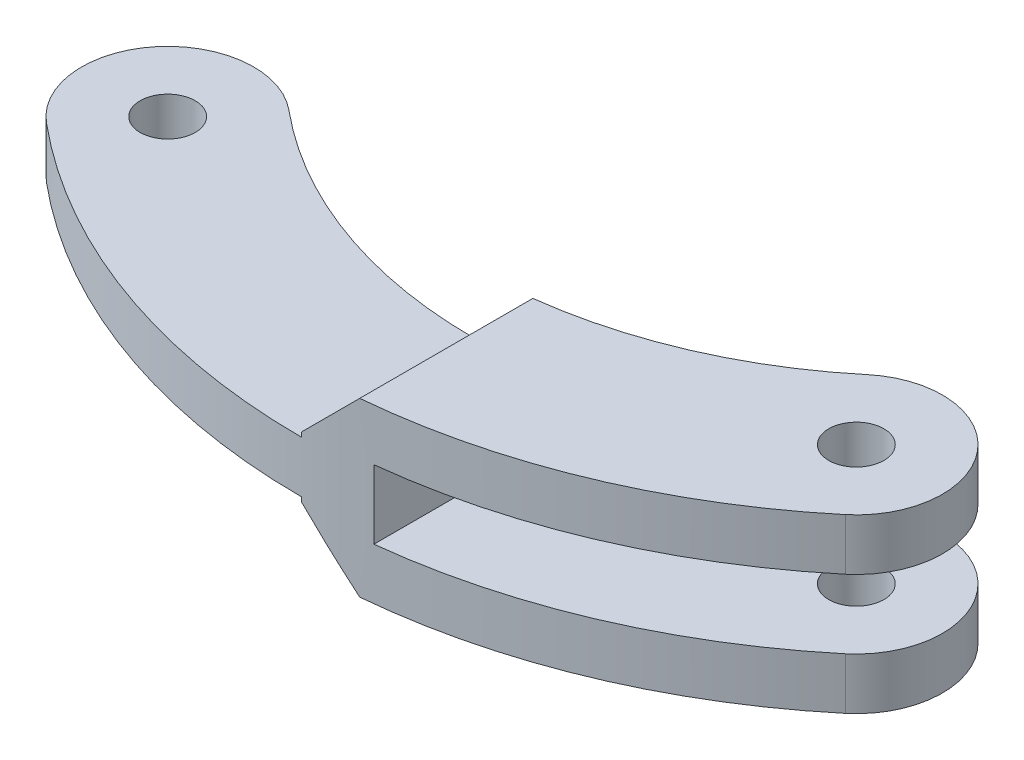
ISO-10303-21;
HEADER;
FILE_DESCRIPTION(('STEP AP214'),'2;1');
FILE_NAME('part.step','',(''),(''),'','','');
FILE_SCHEMA(('AUTOMOTIVE_DESIGN { 1 0 10303 214 1 1 1 1 }'));
ENDSEC;
DATA;
#1=APPLICATION_CONTEXT('core data for automotive mechanical design processes');
#2=APPLICATION_PROTOCOL_DEFINITION('international standard','automotive_design',2000,#1);
#3=PRODUCT_CONTEXT('',#1,'mechanical');
#4=PRODUCT('Part','Part','',(#3));
#5=PRODUCT_RELATED_PRODUCT_CATEGORY('part','',(#4));
#6=PRODUCT_DEFINITION_FORMATION('','',#4);
#7=PRODUCT_DEFINITION_CONTEXT('part definition',#1,'design');
#8=PRODUCT_DEFINITION('design','',#6,#7);
#9=PRODUCT_DEFINITION_SHAPE('','',#8);
#10=(LENGTH_UNIT() NAMED_UNIT(*) SI_UNIT(.MILLI.,.METRE.));
#11=(NAMED_UNIT(*) PLANE_ANGLE_UNIT() SI_UNIT($,.RADIAN.));
#12=(NAMED_UNIT(*) SI_UNIT($,.STERADIAN.) SOLID_ANGLE_UNIT());
#13=UNCERTAINTY_MEASURE_WITH_UNIT(LENGTH_MEASURE(1.E-05),#10,'distance_accuracy_value','');
#14=(GEOMETRIC_REPRESENTATION_CONTEXT(3) GLOBAL_UNCERTAINTY_ASSIGNED_CONTEXT((#13)) GLOBAL_UNIT_ASSIGNED_CONTEXT((#10,
#11,#12)) REPRESENTATION_CONTEXT('',''));
#15=CARTESIAN_POINT('',(0.,0.,0.));
#16=DIRECTION('',(0.,0.,1.));
#17=DIRECTION('',(1.,0.,0.));
#18=AXIS2_PLACEMENT_3D('',#15,#16,#17);
#19=CARTESIAN_POINT('',(20.,0.75,0.));
#20=DIRECTION('',(0.,-1.,0.));
#21=DIRECTION('',(0.,0.,-1.));
#22=AXIS2_PLACEMENT_3D('',#19,#20,#21);
#23=CYLINDRICAL_SURFACE('',#22,2.5);
#24=CARTESIAN_POINT('',(20.,1.,0.));
#25=DIRECTION('',(0.,1.,0.));
#26=DIRECTION('',(0.,0.,1.));
#27=AXIS2_PLACEMENT_3D('',#24,#25,#26);
#28=CIRCLE('',#27,2.5);
#29=CARTESIAN_POINT('',(21.6004609991612,1.,1.92055319899344));
#30=VERTEX_POINT('',#29);
#31=CARTESIAN_POINT('',(18.3995390008388,1.,-1.92055319899344));
#32=VERTEX_POINT('',#31);
#33=EDGE_CURVE('E167',#30,#32,#28,.T.);
#34=ORIENTED_EDGE('',*,*,#33,.T.);
#35=DIRECTION('',(0.,-1.,0.));
#36=VECTOR('',#35,1.);
#37=CARTESIAN_POINT('',(18.3995390008388,0.75,-1.92055319899344));
#38=LINE('',#37,#36);
#39=CARTESIAN_POINT('',(18.3995390008388,2.5,-1.92055319899344));
#40=VERTEX_POINT('',#39);
#41=EDGE_CURVE('E228',#40,#32,#38,.T.);
#42=ORIENTED_EDGE('',*,*,#41,.F.);
#43=CARTESIAN_POINT('',(20.,2.5,0.));
#44=DIRECTION('',(0.,1.,0.));
#45=DIRECTION('',(0.,0.,-1.));
#46=AXIS2_PLACEMENT_3D('',#43,#44,#45);
#47=CIRCLE('',#46,2.5);
#48=CARTESIAN_POINT('',(21.6004609991612,2.5,1.92055319899344));
#49=VERTEX_POINT('',#48);
#50=EDGE_CURVE('E182',#49,#40,#47,.T.);
#51=ORIENTED_EDGE('',*,*,#50,.F.);
#52=DIRECTION('',(0.,-1.,0.));
#53=VECTOR('',#52,1.);
#54=CARTESIAN_POINT('',(21.6004609991612,0.75,1.92055319899344));
#55=LINE('',#54,#53);
#56=EDGE_CURVE('E231',#49,#30,#55,.T.);
#57=ORIENTED_EDGE('',*,*,#56,.T.);
#58=EDGE_LOOP('',(#34,#42,#51,#57));
#59=FACE_BOUND('',#58,.T.);
#60=ADVANCED_FACE('F34',(#59),#23,.T.);
#61=CARTESIAN_POINT('',(20.,0.75,0.));
#62=DIRECTION('',(0.,-1.,0.));
#63=DIRECTION('',(0.,0.,-1.));
#64=AXIS2_PLACEMENT_3D('',#61,#62,#63);
#65=CYLINDRICAL_SURFACE('',#64,0.799999999999999);
#66=CARTESIAN_POINT('',(20.,1.,0.));
#67=DIRECTION('',(0.,1.,0.));
#68=DIRECTION('',(0.,0.,1.));
#69=AXIS2_PLACEMENT_3D('',#66,#67,#68);
#70=CIRCLE('',#69,0.799999999999999);
#71=CARTESIAN_POINT('',(20.,1.,0.799999999999999));
#72=VERTEX_POINT('',#71);
#73=EDGE_CURVE('E158',#72,#72,#70,.T.);
#74=ORIENTED_EDGE('',*,*,#73,.F.);
#75=EDGE_LOOP('',(#74));
#76=FACE_BOUND('',#75,.T.);
#77=CARTESIAN_POINT('',(20.,2.5,0.));
#78=DIRECTION('',(0.,1.,0.));
#79=DIRECTION('',(0.,0.,1.));
#80=AXIS2_PLACEMENT_3D('',#77,#78,#79);
#81=CIRCLE('',#80,0.800000000000006);
#82=CARTESIAN_POINT('',(20.,2.5,0.800000000000006));
#83=VERTEX_POINT('',#82);
#84=EDGE_CURVE('E170',#83,#83,#81,.T.);
#85=ORIENTED_EDGE('',*,*,#84,.T.);
#86=EDGE_LOOP('',(#85));
#87=FACE_BOUND('',#86,.T.);
#88=ADVANCED_FACE('F309',(#76,#87),#65,.F.);
#89=CARTESIAN_POINT('',(15.,0.75,-6.));
#90=DIRECTION('',(0.,1.,0.));
#91=DIRECTION('',(0.,0.,1.));
#92=AXIS2_PLACEMENT_3D('',#89,#90,#91);
#93=PLANE('',#92);
#94=CARTESIAN_POINT('',(0.,0.75,0.));
#95=DIRECTION('',(0.,1.,0.));
#96=DIRECTION('',(0.,0.,1.));
#97=AXIS2_PLACEMENT_3D('',#94,#95,#96);
#98=CIRCLE('',#97,0.8);
#99=CARTESIAN_POINT('',(0.,0.75,0.8));
#100=VERTEX_POINT('',#99);
#101=EDGE_CURVE('E202',#100,#100,#98,.T.);
#102=ORIENTED_EDGE('',*,*,#101,.F.);
#103=EDGE_LOOP('',(#102));
#104=FACE_BOUND('',#103,.T.);
#105=CARTESIAN_POINT('',(10.,0.75,-12.));
#106=DIRECTION('',(0.,1.,0.));
#107=DIRECTION('',(0.,0.,1.));
#108=AXIS2_PLACEMENT_3D('',#105,#106,#107);
#109=CIRCLE('',#108,18.1204993518133);
#110=CARTESIAN_POINT('',(-1.6004609991612,0.75,1.92055319899344));
#111=VERTEX_POINT('',#110);
#112=CARTESIAN_POINT('',(10.,0.75,6.12049935181331));
#113=VERTEX_POINT('',#112);
#114=EDGE_CURVE('E208',#111,#113,#109,.T.);
#115=ORIENTED_EDGE('',*,*,#114,.T.);
#116=DIRECTION('',(0.,0.,-1.));
#117=VECTOR('',#116,1.);
#118=CARTESIAN_POINT('',(10.,0.75,-6.));
#119=LINE('',#118,#117);
#120=CARTESIAN_POINT('',(10.,0.75,1.12049935181331));
#121=VERTEX_POINT('',#120);
#122=EDGE_CURVE('E198',#113,#121,#119,.T.);
#123=ORIENTED_EDGE('',*,*,#122,.T.);
#124=CARTESIAN_POINT('',(10.,0.75,-12.));
#125=DIRECTION('',(0.,-1.,0.));
#126=DIRECTION('',(0.,0.,-1.));
#127=AXIS2_PLACEMENT_3D('',#124,#125,#126);
#128=CIRCLE('',#127,13.1204993518133);
#129=CARTESIAN_POINT('',(1.6004609991612,0.75,-1.92055319899344));
#130=VERTEX_POINT('',#129);
#131=EDGE_CURVE('E211',#121,#130,#128,.T.);
#132=ORIENTED_EDGE('',*,*,#131,.T.);
#133=CARTESIAN_POINT('',(0.,0.75,0.));
#134=DIRECTION('',(0.,1.,0.));
#135=DIRECTION('',(0.,0.,1.));
#136=AXIS2_PLACEMENT_3D('',#133,#134,#135);
#137=CIRCLE('',#136,2.5);
#138=EDGE_CURVE('E214',#130,#111,#137,.T.);
#139=ORIENTED_EDGE('',*,*,#138,.T.);
#140=EDGE_LOOP('',(#115,#123,#132,#139));
#141=FACE_BOUND('',#140,.T.);
#142=ADVANCED_FACE('F281',(#104,#141),#93,.T.);
#143=CARTESIAN_POINT('',(15.,-0.75,-6.));
#144=DIRECTION('',(0.,1.,0.));
#145=DIRECTION('',(0.,0.,1.));
#146=AXIS2_PLACEMENT_3D('',#143,#144,#145);
#147=PLANE('',#146);
#148=CARTESIAN_POINT('',(0.,-0.75,0.));
#149=DIRECTION('',(0.,1.,0.));
#150=DIRECTION('',(0.,0.,1.));
#151=AXIS2_PLACEMENT_3D('',#148,#149,#150);
#152=CIRCLE('',#151,0.8);
#153=CARTESIAN_POINT('',(0.,-0.75,0.8));
#154=VERTEX_POINT('',#153);
#155=EDGE_CURVE('E201',#154,#154,#152,.T.);
#156=ORIENTED_EDGE('',*,*,#155,.T.);
#157=EDGE_LOOP('',(#156));
#158=FACE_BOUND('',#157,.T.);
#159=DIRECTION('',(0.,0.,-1.));
#160=VECTOR('',#159,1.);
#161=CARTESIAN_POINT('',(10.,-0.75,-6.));
#162=LINE('',#161,#160);
#163=CARTESIAN_POINT('',(10.,-0.75,6.12049935181331));
#164=VERTEX_POINT('',#163);
#165=CARTESIAN_POINT('',(10.,-0.75,1.12049935181331));
#166=VERTEX_POINT('',#165);
#167=EDGE_CURVE('E196',#164,#166,#162,.T.);
#168=ORIENTED_EDGE('',*,*,#167,.F.);
#169=CARTESIAN_POINT('',(10.,-0.75,-12.));
#170=DIRECTION('',(0.,1.,0.));
#171=DIRECTION('',(0.,0.,1.));
#172=AXIS2_PLACEMENT_3D('',#169,#170,#171);
#173=CIRCLE('',#172,18.1204993518133);
#174=CARTESIAN_POINT('',(-1.6004609991612,-0.75,1.92055319899344));
#175=VERTEX_POINT('',#174);
#176=EDGE_CURVE('E205',#175,#164,#173,.T.);
#177=ORIENTED_EDGE('',*,*,#176,.F.);
#178=CARTESIAN_POINT('',(0.,-0.75,0.));
#179=DIRECTION('',(0.,1.,0.));
#180=DIRECTION('',(0.,0.,1.));
#181=AXIS2_PLACEMENT_3D('',#178,#179,#180);
#182=CIRCLE('',#181,2.5);
#183=CARTESIAN_POINT('',(1.6004609991612,-0.75,-1.92055319899344));
#184=VERTEX_POINT('',#183);
#185=EDGE_CURVE('E212',#184,#175,#182,.T.);
#186=ORIENTED_EDGE('',*,*,#185,.F.);
#187=CARTESIAN_POINT('',(10.,-0.75,-12.));
#188=DIRECTION('',(0.,-1.,0.));
#189=DIRECTION('',(0.,0.,-1.));
#190=AXIS2_PLACEMENT_3D('',#187,#188,#189);
#191=CIRCLE('',#190,13.1204993518133);
#192=EDGE_CURVE('E219',#166,#184,#191,.T.);
#193=ORIENTED_EDGE('',*,*,#192,.F.);
#194=EDGE_LOOP('',(#168,#177,#186,#193));
#195=FACE_BOUND('',#194,.T.);
#196=ADVANCED_FACE('F290',(#158,#195),#147,.F.);
#197=CARTESIAN_POINT('',(10.,0.75,-12.));
#198=DIRECTION('',(0.,-1.,0.));
#199=DIRECTION('',(0.,0.,-1.));
#200=AXIS2_PLACEMENT_3D('',#197,#198,#199);
#201=CYLINDRICAL_SURFACE('',#200,18.1204993518133);
#202=DIRECTION('',(0.,-1.,0.));
#203=VECTOR('',#202,1.);
#204=CARTESIAN_POINT('',(12.,0.75,6.00978891489477));
#205=LINE('',#204,#203);
#206=CARTESIAN_POINT('',(12.,-1.,6.00978891489477));
#207=VERTEX_POINT('',#206);
#208=CARTESIAN_POINT('',(12.,1.,6.00978891489477));
#209=VERTEX_POINT('',#208);
#210=EDGE_CURVE('E138',#207,#209,#205,.F.);
#211=ORIENTED_EDGE('',*,*,#210,.T.);
#212=CARTESIAN_POINT('',(10.,1.,-12.));
#213=DIRECTION('',(0.,1.,0.));
#214=DIRECTION('',(0.,0.,1.));
#215=AXIS2_PLACEMENT_3D('',#212,#213,#214);
#216=CIRCLE('',#215,18.1204993518133);
#217=EDGE_CURVE('E148',#209,#30,#216,.T.);
#218=ORIENTED_EDGE('',*,*,#217,.T.);
#219=ORIENTED_EDGE('',*,*,#56,.F.);
#220=CARTESIAN_POINT('',(10.,2.5,-12.));
#221=DIRECTION('',(0.,1.,0.));
#222=DIRECTION('',(0.,0.,1.));
#223=AXIS2_PLACEMENT_3D('',#220,#221,#222);
#224=CIRCLE('',#223,18.1204993518133);
#225=CARTESIAN_POINT('',(11.625,2.5,6.04748934780311));
#226=VERTEX_POINT('',#225);
#227=EDGE_CURVE('E179',#226,#49,#224,.T.);
#228=ORIENTED_EDGE('',*,*,#227,.F.);
#229=CARTESIAN_POINT('',(10.,0.874999999999996,-12.));
#230=DIRECTION('',(-0.707106781186549,0.707106781186546,0.));
#231=DIRECTION('',(-0.707106781186546,-0.707106781186549,0.));
#232=AXIS2_PLACEMENT_3D('',#229,#230,#231);
#233=ELLIPSE('',#232,25.6262559403073,18.1204993518133);
#234=CARTESIAN_POINT('',(10.,0.874999999999999,6.12049935181331));
#235=VERTEX_POINT('',#234);
#236=EDGE_CURVE('E239',#226,#235,#233,.F.);
#237=ORIENTED_EDGE('',*,*,#236,.T.);
#238=DIRECTION('',(0.,-1.,0.));
#239=VECTOR('',#238,1.);
#240=CARTESIAN_POINT('',(10.,2.5,6.12049935181331));
#241=LINE('',#240,#239);
#242=EDGE_CURVE('E191',#235,#113,#241,.T.);
#243=ORIENTED_EDGE('',*,*,#242,.T.);
#244=ORIENTED_EDGE('',*,*,#114,.F.);
#245=DIRECTION('',(0.,-1.,0.));
#246=VECTOR('',#245,1.);
#247=CARTESIAN_POINT('',(-1.6004609991612,0.75,1.92055319899344));
#248=LINE('',#247,#246);
#249=EDGE_CURVE('E216',#111,#175,#248,.T.);
#250=ORIENTED_EDGE('',*,*,#249,.T.);
#251=ORIENTED_EDGE('',*,*,#176,.T.);
#252=CARTESIAN_POINT('',(10.,-0.875000000000009,6.12049935181331));
#253=VERTEX_POINT('',#252);
#254=EDGE_CURVE('E185',#164,#253,#241,.T.);
#255=ORIENTED_EDGE('',*,*,#254,.T.);
#256=CARTESIAN_POINT('',(10.,-0.875000000000006,-12.));
#257=DIRECTION('',(0.707106781186546,0.707106781186549,0.));
#258=DIRECTION('',(0.707106781186549,-0.707106781186546,0.));
#259=AXIS2_PLACEMENT_3D('',#256,#257,#258);
#260=ELLIPSE('',#259,25.6262559403072,18.1204993518133);
#261=CARTESIAN_POINT('',(11.625,-2.5,6.04748934780311));
#262=VERTEX_POINT('',#261);
#263=EDGE_CURVE('E237',#253,#262,#260,.T.);
#264=ORIENTED_EDGE('',*,*,#263,.T.);
#265=CARTESIAN_POINT('',(10.,-2.5,-12.));
#266=DIRECTION('',(0.,1.,0.));
#267=DIRECTION('',(0.,0.,1.));
#268=AXIS2_PLACEMENT_3D('',#265,#266,#267);
#269=CIRCLE('',#268,18.1204993518133);
#270=CARTESIAN_POINT('',(21.6004609991612,-2.5,1.92055319899344));
#271=VERTEX_POINT('',#270);
#272=EDGE_CURVE('E187',#262,#271,#269,.T.);
#273=ORIENTED_EDGE('',*,*,#272,.T.);
#274=CARTESIAN_POINT('',(21.6004609991612,-1.,1.92055319899344));
#275=VERTEX_POINT('',#274);
#276=EDGE_CURVE('E157',#275,#271,#55,.T.);
#277=ORIENTED_EDGE('',*,*,#276,.F.);
#278=CARTESIAN_POINT('',(10.,-1.,-12.));
#279=DIRECTION('',(0.,-1.,0.));
#280=DIRECTION('',(0.,0.,-1.));
#281=AXIS2_PLACEMENT_3D('',#278,#279,#280);
#282=CIRCLE('',#281,18.1204993518133);
#283=EDGE_CURVE('E151',#275,#207,#282,.T.);
#284=ORIENTED_EDGE('',*,*,#283,.T.);
#285=EDGE_LOOP('',(#211,#218,#219,#228,#237,#243,#244,#250,#251,#255,#264,#273,#277,#284));
#286=FACE_BOUND('',#285,.T.);
#287=ADVANCED_FACE('F155',(#286),#201,.T.);
#288=CARTESIAN_POINT('',(18.3995390008388,-1.,-1.92055319899344));
#289=VERTEX_POINT('',#288);
#290=CARTESIAN_POINT('',(18.3995390008388,-2.5,-1.92055319899344));
#291=VERTEX_POINT('',#290);
#292=EDGE_CURVE('E227',#289,#291,#38,.T.);
#293=ORIENTED_EDGE('',*,*,#292,.F.);
#294=CARTESIAN_POINT('',(20.,-1.,0.));
#295=DIRECTION('',(0.,-1.,0.));
#296=DIRECTION('',(0.,0.,-1.));
#297=AXIS2_PLACEMENT_3D('',#294,#295,#296);
#298=CIRCLE('',#297,2.5);
#299=EDGE_CURVE('E49',#289,#275,#298,.T.);
#300=ORIENTED_EDGE('',*,*,#299,.T.);
#301=ORIENTED_EDGE('',*,*,#276,.T.);
#302=CARTESIAN_POINT('',(20.,-2.5,0.));
#303=DIRECTION('',(0.,1.,0.));
#304=DIRECTION('',(0.,0.,-1.));
#305=AXIS2_PLACEMENT_3D('',#302,#303,#304);
#306=CIRCLE('',#305,2.5);
#307=EDGE_CURVE('E180',#271,#291,#306,.T.);
#308=ORIENTED_EDGE('',*,*,#307,.T.);
#309=EDGE_LOOP('',(#293,#300,#301,#308));
#310=FACE_BOUND('',#309,.T.);
#311=ADVANCED_FACE('F305',(#310),#23,.T.);
#312=CARTESIAN_POINT('',(10.,0.75,-12.));
#313=DIRECTION('',(0.,-1.,0.));
#314=DIRECTION('',(0.,0.,-1.));
#315=AXIS2_PLACEMENT_3D('',#312,#313,#314);
#316=CYLINDRICAL_SURFACE('',#315,13.1204993518133);
#317=ORIENTED_EDGE('',*,*,#41,.T.);
#318=CARTESIAN_POINT('',(10.,1.,-12.));
#319=DIRECTION('',(0.,1.,0.));
#320=DIRECTION('',(0.,0.,1.));
#321=AXIS2_PLACEMENT_3D('',#318,#319,#320);
#322=CIRCLE('',#321,13.1204993518133);
#323=CARTESIAN_POINT('',(12.,1.,0.967170209453312));
#324=VERTEX_POINT('',#323);
#325=EDGE_CURVE('E161',#32,#324,#322,.F.);
#326=ORIENTED_EDGE('',*,*,#325,.T.);
#327=DIRECTION('',(0.,-1.,0.));
#328=VECTOR('',#327,1.);
#329=CARTESIAN_POINT('',(12.,0.75,0.967170209453312));
#330=LINE('',#329,#328);
#331=CARTESIAN_POINT('',(12.,-1.,0.967170209453312));
#332=VERTEX_POINT('',#331);
#333=EDGE_CURVE('E11',#324,#332,#330,.T.);
#334=ORIENTED_EDGE('',*,*,#333,.T.);
#335=CARTESIAN_POINT('',(10.,-1.,-12.));
#336=DIRECTION('',(0.,-1.,0.));
#337=DIRECTION('',(0.,0.,-1.));
#338=AXIS2_PLACEMENT_3D('',#335,#336,#337);
#339=CIRCLE('',#338,13.1204993518133);
#340=EDGE_CURVE('E152',#332,#289,#339,.F.);
#341=ORIENTED_EDGE('',*,*,#340,.T.);
#342=ORIENTED_EDGE('',*,*,#292,.T.);
#343=CARTESIAN_POINT('',(10.,-2.5,-12.));
#344=DIRECTION('',(0.,-1.,0.));
#345=DIRECTION('',(0.,0.,1.));
#346=AXIS2_PLACEMENT_3D('',#343,#344,#345);
#347=CIRCLE('',#346,13.1204993518133);
#348=CARTESIAN_POINT('',(11.625,-2.5,1.01948072086339));
#349=VERTEX_POINT('',#348);
#350=EDGE_CURVE('E173',#291,#349,#347,.T.);
#351=ORIENTED_EDGE('',*,*,#350,.T.);
#352=CARTESIAN_POINT('',(10.,-0.875000000000006,-12.));
#353=DIRECTION('',(0.707106781186546,0.707106781186549,0.));
#354=DIRECTION('',(0.707106781186549,-0.707106781186546,0.));
#355=AXIS2_PLACEMENT_3D('',#352,#353,#354);
#356=ELLIPSE('',#355,18.5551881284417,13.1204993518133);
#357=CARTESIAN_POINT('',(10.,-0.875000000000009,1.12049935181331));
#358=VERTEX_POINT('',#357);
#359=EDGE_CURVE('E57',#349,#358,#356,.F.);
#360=ORIENTED_EDGE('',*,*,#359,.T.);
#361=DIRECTION('',(0.,-1.,0.));
#362=VECTOR('',#361,1.);
#363=CARTESIAN_POINT('',(10.,2.5,1.12049935181331));
#364=LINE('',#363,#362);
#365=EDGE_CURVE('E193',#166,#358,#364,.T.);
#366=ORIENTED_EDGE('',*,*,#365,.F.);
#367=ORIENTED_EDGE('',*,*,#192,.T.);
#368=DIRECTION('',(0.,-1.,0.));
#369=VECTOR('',#368,1.);
#370=CARTESIAN_POINT('',(1.6004609991612,0.75,-1.92055319899344));
#371=LINE('',#370,#369);
#372=EDGE_CURVE('E224',#130,#184,#371,.T.);
#373=ORIENTED_EDGE('',*,*,#372,.F.);
#374=ORIENTED_EDGE('',*,*,#131,.F.);
#375=CARTESIAN_POINT('',(10.,0.874999999999999,1.12049935181331));
#376=VERTEX_POINT('',#375);
#377=EDGE_CURVE('E194',#376,#121,#364,.T.);
#378=ORIENTED_EDGE('',*,*,#377,.F.);
#379=CARTESIAN_POINT('',(10.,0.874999999999996,-12.));
#380=DIRECTION('',(-0.707106781186549,0.707106781186546,0.));
#381=DIRECTION('',(-0.707106781186546,-0.707106781186549,0.));
#382=AXIS2_PLACEMENT_3D('',#379,#380,#381);
#383=ELLIPSE('',#382,18.5551881284418,13.1204993518133);
#384=CARTESIAN_POINT('',(11.625,2.5,1.01948072086339));
#385=VERTEX_POINT('',#384);
#386=EDGE_CURVE('E244',#376,#385,#383,.T.);
#387=ORIENTED_EDGE('',*,*,#386,.T.);
#388=CARTESIAN_POINT('',(10.,2.5,-12.));
#389=DIRECTION('',(0.,-1.,0.));
#390=DIRECTION('',(0.,0.,1.));
#391=AXIS2_PLACEMENT_3D('',#388,#389,#390);
#392=CIRCLE('',#391,13.1204993518133);
#393=EDGE_CURVE('E176',#40,#385,#392,.T.);
#394=ORIENTED_EDGE('',*,*,#393,.F.);
#395=EDGE_LOOP('',(#317,#326,#334,#341,#342,#351,#360,#366,#367,#373,#374,#378,#387,#394));
#396=FACE_BOUND('',#395,.T.);
#397=ADVANCED_FACE('F258',(#396),#316,.F.);
#398=CARTESIAN_POINT('',(0.,0.75,0.));
#399=DIRECTION('',(0.,-1.,0.));
#400=DIRECTION('',(0.,0.,-1.));
#401=AXIS2_PLACEMENT_3D('',#398,#399,#400);
#402=CYLINDRICAL_SURFACE('',#401,2.5);
#403=ORIENTED_EDGE('',*,*,#185,.T.);
#404=ORIENTED_EDGE('',*,*,#249,.F.);
#405=ORIENTED_EDGE('',*,*,#138,.F.);
#406=ORIENTED_EDGE('',*,*,#372,.T.);
#407=EDGE_LOOP('',(#403,#404,#405,#406));
#408=FACE_BOUND('',#407,.T.);
#409=ADVANCED_FACE('F295',(#408),#402,.T.);
#410=CARTESIAN_POINT('',(0.,0.75,0.));
#411=DIRECTION('',(0.,-1.,0.));
#412=DIRECTION('',(0.,0.,-1.));
#413=AXIS2_PLACEMENT_3D('',#410,#411,#412);
#414=CYLINDRICAL_SURFACE('',#413,0.8);
#415=ORIENTED_EDGE('',*,*,#101,.T.);
#416=EDGE_LOOP('',(#415));
#417=FACE_BOUND('',#416,.T.);
#418=ORIENTED_EDGE('',*,*,#155,.F.);
#419=EDGE_LOOP('',(#418));
#420=FACE_BOUND('',#419,.T.);
#421=ADVANCED_FACE('F297',(#417,#420),#414,.F.);
#422=CARTESIAN_POINT('',(10.,2.5,1.12049935181331));
#423=DIRECTION('',(1.,0.,0.));
#424=DIRECTION('',(0.,0.,-1.));
#425=AXIS2_PLACEMENT_3D('',#422,#423,#424);
#426=PLANE('',#425);
#427=ORIENTED_EDGE('',*,*,#365,.T.);
#428=DIRECTION('',(0.,0.,1.));
#429=VECTOR('',#428,1.);
#430=CARTESIAN_POINT('',(10.,-0.875000000000009,1.12049935181331));
#431=LINE('',#430,#429);
#432=EDGE_CURVE('E246',#358,#253,#431,.T.);
#433=ORIENTED_EDGE('',*,*,#432,.T.);
#434=ORIENTED_EDGE('',*,*,#254,.F.);
#435=ORIENTED_EDGE('',*,*,#167,.T.);
#436=EDGE_LOOP('',(#427,#433,#434,#435));
#437=FACE_BOUND('',#436,.T.);
#438=ADVANCED_FACE('F293',(#437),#426,.F.);
#439=CARTESIAN_POINT('',(10.,-2.5,-12.));
#440=DIRECTION('',(0.,1.,0.));
#441=DIRECTION('',(0.,0.,1.));
#442=AXIS2_PLACEMENT_3D('',#439,#440,#441);
#443=PLANE('',#442);
#444=ORIENTED_EDGE('',*,*,#272,.F.);
#445=DIRECTION('',(0.,0.,-1.));
#446=VECTOR('',#445,1.);
#447=CARTESIAN_POINT('',(11.625,-2.5,-12.));
#448=LINE('',#447,#446);
#449=EDGE_CURVE('E42',#262,#349,#448,.T.);
#450=ORIENTED_EDGE('',*,*,#449,.T.);
#451=ORIENTED_EDGE('',*,*,#350,.F.);
#452=ORIENTED_EDGE('',*,*,#307,.F.);
#453=EDGE_LOOP('',(#444,#450,#451,#452));
#454=FACE_BOUND('',#453,.T.);
#455=CARTESIAN_POINT('',(20.,-2.5,0.));
#456=DIRECTION('',(0.,1.,0.));
#457=DIRECTION('',(0.,0.,1.));
#458=AXIS2_PLACEMENT_3D('',#455,#456,#457);
#459=CIRCLE('',#458,0.800000000000006);
#460=CARTESIAN_POINT('',(20.,-2.5,0.800000000000006));
#461=VERTEX_POINT('',#460);
#462=EDGE_CURVE('E147',#461,#461,#459,.T.);
#463=ORIENTED_EDGE('',*,*,#462,.T.);
#464=EDGE_LOOP('',(#463));
#465=FACE_BOUND('',#464,.T.);
#466=ADVANCED_FACE('F330',(#454,#465),#443,.F.);
#467=CARTESIAN_POINT('',(20.,-1.,0.));
#468=DIRECTION('',(0.,-1.,0.));
#469=DIRECTION('',(0.,0.,-1.));
#470=AXIS2_PLACEMENT_3D('',#467,#468,#469);
#471=CIRCLE('',#470,0.799999999999999);
#472=CARTESIAN_POINT('',(20.,-1.,-0.799999999999999));
#473=VERTEX_POINT('',#472);
#474=EDGE_CURVE('E250',#473,#473,#471,.T.);
#475=ORIENTED_EDGE('',*,*,#474,.F.);
#476=EDGE_LOOP('',(#475));
#477=FACE_BOUND('',#476,.T.);
#478=ORIENTED_EDGE('',*,*,#462,.F.);
#479=EDGE_LOOP('',(#478));
#480=FACE_BOUND('',#479,.T.);
#481=ADVANCED_FACE('F316',(#477,#480),#65,.F.);
#482=CARTESIAN_POINT('',(10.,2.5,-12.));
#483=DIRECTION('',(0.,1.,0.));
#484=DIRECTION('',(0.,0.,1.));
#485=AXIS2_PLACEMENT_3D('',#482,#483,#484);
#486=PLANE('',#485);
#487=ORIENTED_EDGE('',*,*,#393,.T.);
#488=DIRECTION('',(0.,0.,1.));
#489=VECTOR('',#488,1.);
#490=CARTESIAN_POINT('',(11.625,2.5,6.12049935181331));
#491=LINE('',#490,#489);
#492=EDGE_CURVE('E234',#385,#226,#491,.T.);
#493=ORIENTED_EDGE('',*,*,#492,.T.);
#494=ORIENTED_EDGE('',*,*,#227,.T.);
#495=ORIENTED_EDGE('',*,*,#50,.T.);
#496=EDGE_LOOP('',(#487,#493,#494,#495));
#497=FACE_BOUND('',#496,.T.);
#498=ORIENTED_EDGE('',*,*,#84,.F.);
#499=EDGE_LOOP('',(#498));
#500=FACE_BOUND('',#499,.T.);
#501=ADVANCED_FACE('F263',(#497,#500),#486,.T.);
#502=ORIENTED_EDGE('',*,*,#242,.F.);
#503=DIRECTION('',(0.,0.,-1.));
#504=VECTOR('',#503,1.);
#505=CARTESIAN_POINT('',(10.,0.874999999999999,1.12049935181331));
#506=LINE('',#505,#504);
#507=EDGE_CURVE('E241',#235,#376,#506,.T.);
#508=ORIENTED_EDGE('',*,*,#507,.T.);
#509=ORIENTED_EDGE('',*,*,#377,.T.);
#510=ORIENTED_EDGE('',*,*,#122,.F.);
#511=EDGE_LOOP('',(#502,#508,#509,#510));
#512=FACE_BOUND('',#511,.T.);
#513=ADVANCED_FACE('F274',(#512),#426,.F.);
#514=CARTESIAN_POINT('',(11.625,2.5,-12.));
#515=DIRECTION('',(-0.707106781186549,0.707106781186546,0.));
#516=DIRECTION('',(0.,0.,-1.));
#517=AXIS2_PLACEMENT_3D('',#514,#515,#516);
#518=PLANE('',#517);
#519=ORIENTED_EDGE('',*,*,#386,.F.);
#520=ORIENTED_EDGE('',*,*,#507,.F.);
#521=ORIENTED_EDGE('',*,*,#236,.F.);
#522=ORIENTED_EDGE('',*,*,#492,.F.);
#523=EDGE_LOOP('',(#519,#520,#521,#522));
#524=FACE_BOUND('',#523,.T.);
#525=ADVANCED_FACE('F277',(#524),#518,.T.);
#526=CARTESIAN_POINT('',(10.,-0.875000000000009,1.12049935181331));
#527=DIRECTION('',(0.707106781186546,0.707106781186549,0.));
#528=DIRECTION('',(0.,0.,1.));
#529=AXIS2_PLACEMENT_3D('',#526,#527,#528);
#530=PLANE('',#529);
#531=ORIENTED_EDGE('',*,*,#359,.F.);
#532=ORIENTED_EDGE('',*,*,#449,.F.);
#533=ORIENTED_EDGE('',*,*,#263,.F.);
#534=ORIENTED_EDGE('',*,*,#432,.F.);
#535=EDGE_LOOP('',(#531,#532,#533,#534));
#536=FACE_BOUND('',#535,.T.);
#537=ADVANCED_FACE('F36',(#536),#530,.F.);
#538=CARTESIAN_POINT('',(12.,-1.,6.12049935181331));
#539=DIRECTION('',(-1.,0.,0.));
#540=DIRECTION('',(0.,0.,1.));
#541=AXIS2_PLACEMENT_3D('',#538,#539,#540);
#542=PLANE('',#541);
#543=DIRECTION('',(0.,0.,-1.));
#544=VECTOR('',#543,1.);
#545=CARTESIAN_POINT('',(12.,-1.,6.12049935181331));
#546=LINE('',#545,#544);
#547=EDGE_CURVE('E141',#207,#332,#546,.T.);
#548=ORIENTED_EDGE('',*,*,#547,.T.);
#549=ORIENTED_EDGE('',*,*,#333,.F.);
#550=DIRECTION('',(0.,0.,-1.));
#551=VECTOR('',#550,1.);
#552=CARTESIAN_POINT('',(12.,1.,6.12049935181331));
#553=LINE('',#552,#551);
#554=EDGE_CURVE('E143',#209,#324,#553,.T.);
#555=ORIENTED_EDGE('',*,*,#554,.F.);
#556=ORIENTED_EDGE('',*,*,#210,.F.);
#557=EDGE_LOOP('',(#548,#549,#555,#556));
#558=FACE_BOUND('',#557,.T.);
#559=ADVANCED_FACE('F140',(#558),#542,.F.);
#560=CARTESIAN_POINT('',(22.5,1.,6.12049935181331));
#561=DIRECTION('',(0.,1.,0.));
#562=DIRECTION('',(0.,0.,1.));
#563=AXIS2_PLACEMENT_3D('',#560,#561,#562);
#564=PLANE('',#563);
#565=ORIENTED_EDGE('',*,*,#73,.T.);
#566=EDGE_LOOP('',(#565));
#567=FACE_BOUND('',#566,.T.);
#568=ORIENTED_EDGE('',*,*,#554,.T.);
#569=ORIENTED_EDGE('',*,*,#325,.F.);
#570=ORIENTED_EDGE('',*,*,#33,.F.);
#571=ORIENTED_EDGE('',*,*,#217,.F.);
#572=EDGE_LOOP('',(#568,#569,#570,#571));
#573=FACE_BOUND('',#572,.T.);
#574=ADVANCED_FACE('F257',(#567,#573),#564,.F.);
#575=CARTESIAN_POINT('',(22.5,-1.,6.12049935181331));
#576=DIRECTION('',(0.,-1.,0.));
#577=DIRECTION('',(0.,0.,-1.));
#578=AXIS2_PLACEMENT_3D('',#575,#576,#577);
#579=PLANE('',#578);
#580=ORIENTED_EDGE('',*,*,#474,.T.);
#581=EDGE_LOOP('',(#580));
#582=FACE_BOUND('',#581,.T.);
#583=ORIENTED_EDGE('',*,*,#299,.F.);
#584=ORIENTED_EDGE('',*,*,#340,.F.);
#585=ORIENTED_EDGE('',*,*,#547,.F.);
#586=ORIENTED_EDGE('',*,*,#283,.F.);
#587=EDGE_LOOP('',(#583,#584,#585,#586));
#588=FACE_BOUND('',#587,.T.);
#589=ADVANCED_FACE('F150',(#582,#588),#579,.F.);
#590=CLOSED_SHELL('',(#60,#88,#142,#196,#287,#311,#397,#409,#421,#438,#466,#481,#501,#513,#525,
#537,#559,#574,#589));
#591=MANIFOLD_SOLID_BREP('B2',#590);
#592=ADVANCED_BREP_SHAPE_REPRESENTATION('',(#18,#591),#14);
#593=SHAPE_DEFINITION_REPRESENTATION(#9,#592);
ENDSEC;
END-ISO-10303-21;
